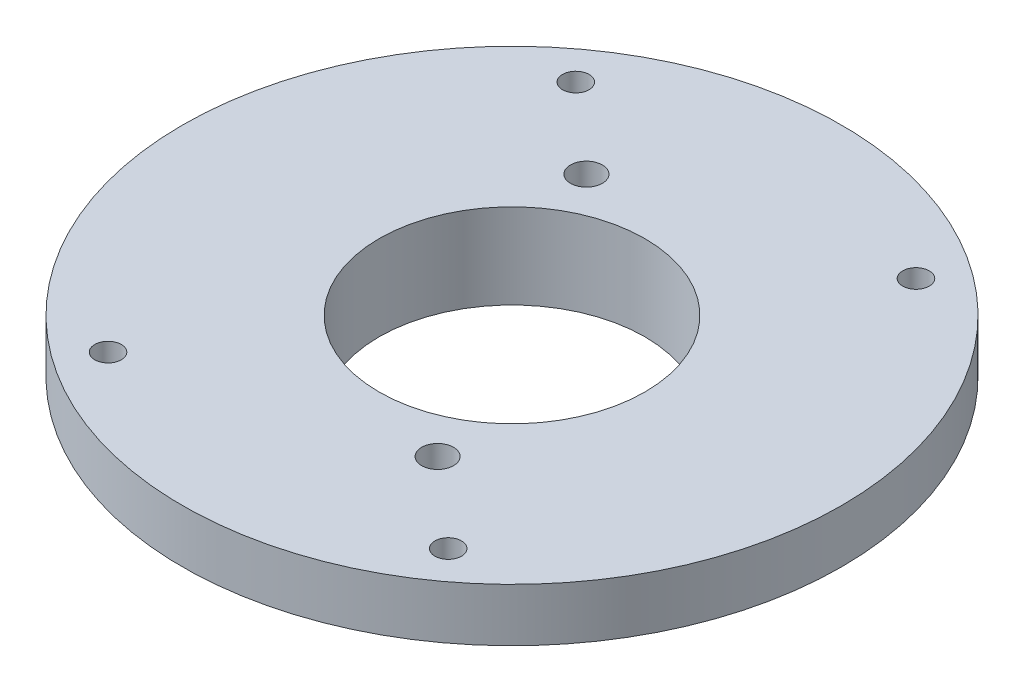
ISO-10303-21;
HEADER;
FILE_DESCRIPTION(('STEP AP214'),'2;1');
FILE_NAME('part.step','',(''),(''),'','','');
FILE_SCHEMA(('AUTOMOTIVE_DESIGN { 1 0 10303 214 1 1 1 1 }'));
ENDSEC;
DATA;
#1=APPLICATION_CONTEXT('core data for automotive mechanical design processes');
#2=APPLICATION_PROTOCOL_DEFINITION('international standard','automotive_design',2000,#1);
#3=PRODUCT_CONTEXT('',#1,'mechanical');
#4=PRODUCT('Part','Part','',(#3));
#5=PRODUCT_RELATED_PRODUCT_CATEGORY('part','',(#4));
#6=PRODUCT_DEFINITION_FORMATION('','',#4);
#7=PRODUCT_DEFINITION_CONTEXT('part definition',#1,'design');
#8=PRODUCT_DEFINITION('design','',#6,#7);
#9=PRODUCT_DEFINITION_SHAPE('','',#8);
#10=(LENGTH_UNIT() NAMED_UNIT(*) SI_UNIT(.MILLI.,.METRE.));
#11=(NAMED_UNIT(*) PLANE_ANGLE_UNIT() SI_UNIT($,.RADIAN.));
#12=(NAMED_UNIT(*) SI_UNIT($,.STERADIAN.) SOLID_ANGLE_UNIT());
#13=UNCERTAINTY_MEASURE_WITH_UNIT(LENGTH_MEASURE(1.E-05),#10,'distance_accuracy_value','');
#14=(GEOMETRIC_REPRESENTATION_CONTEXT(3) GLOBAL_UNCERTAINTY_ASSIGNED_CONTEXT((#13)) GLOBAL_UNIT_ASSIGNED_CONTEXT((#10,
#11,#12)) REPRESENTATION_CONTEXT('',''));
#15=CARTESIAN_POINT('',(0.,0.,0.));
#16=DIRECTION('',(0.,0.,1.));
#17=DIRECTION('',(1.,0.,0.));
#18=AXIS2_PLACEMENT_3D('',#15,#16,#17);
#19=CARTESIAN_POINT('',(-12.4999999999999,8.00000000000005,0.));
#20=DIRECTION('',(0.,1.,0.));
#21=DIRECTION('',(-1.,0.,0.));
#22=AXIS2_PLACEMENT_3D('',#19,#20,#21);
#23=PLANE('',#22);
#24=CARTESIAN_POINT('',(8.,8.00000000000005,15.));
#25=DIRECTION('',(0.,1.,0.));
#26=DIRECTION('',(-1.,0.,0.));
#27=AXIS2_PLACEMENT_3D('',#24,#25,#26);
#28=CIRCLE('',#27,1.5);
#29=CARTESIAN_POINT('',(6.50000000000001,8.00000000000005,15.));
#30=VERTEX_POINT('',#29);
#31=EDGE_CURVE('E108',#30,#30,#28,.T.);
#32=ORIENTED_EDGE('',*,*,#31,.F.);
#33=EDGE_LOOP('',(#32));
#34=FACE_BOUND('',#33,.T.);
#35=CARTESIAN_POINT('',(-8.00000000000033,8.00000000000005,-14.9999999999998));
#36=DIRECTION('',(0.,1.,0.));
#37=DIRECTION('',(-1.,0.,0.));
#38=AXIS2_PLACEMENT_3D('',#35,#36,#37);
#39=CIRCLE('',#38,1.5);
#40=CARTESIAN_POINT('',(-9.50000000000032,8.00000000000005,-14.9999999999998));
#41=VERTEX_POINT('',#40);
#42=EDGE_CURVE('E112',#41,#41,#39,.T.);
#43=ORIENTED_EDGE('',*,*,#42,.F.);
#44=EDGE_LOOP('',(#43));
#45=FACE_BOUND('',#44,.T.);
#46=CARTESIAN_POINT('',(-16.,8.00000000000005,22.));
#47=DIRECTION('',(0.,1.,0.));
#48=DIRECTION('',(-1.,0.,0.));
#49=AXIS2_PLACEMENT_3D('',#46,#47,#48);
#50=CIRCLE('',#49,1.25);
#51=CARTESIAN_POINT('',(-17.25,8.00000000000005,22.));
#52=VERTEX_POINT('',#51);
#53=EDGE_CURVE('E68',#52,#52,#50,.T.);
#54=ORIENTED_EDGE('',*,*,#53,.F.);
#55=EDGE_LOOP('',(#54));
#56=FACE_BOUND('',#55,.T.);
#57=CARTESIAN_POINT('',(16.,8.00000000000006,22.));
#58=DIRECTION('',(0.,1.,0.));
#59=DIRECTION('',(-1.,0.,0.));
#60=AXIS2_PLACEMENT_3D('',#57,#58,#59);
#61=CIRCLE('',#60,1.25);
#62=CARTESIAN_POINT('',(14.75,8.00000000000006,22.));
#63=VERTEX_POINT('',#62);
#64=EDGE_CURVE('E58',#63,#63,#61,.T.);
#65=ORIENTED_EDGE('',*,*,#64,.F.);
#66=EDGE_LOOP('',(#65));
#67=FACE_BOUND('',#66,.T.);
#68=CARTESIAN_POINT('',(16.,8.00000000000006,-22.));
#69=DIRECTION('',(0.,1.,0.));
#70=DIRECTION('',(-1.,0.,0.));
#71=AXIS2_PLACEMENT_3D('',#68,#69,#70);
#72=CIRCLE('',#71,1.25);
#73=CARTESIAN_POINT('',(14.75,8.00000000000006,-22.));
#74=VERTEX_POINT('',#73);
#75=EDGE_CURVE('E55',#74,#74,#72,.T.);
#76=ORIENTED_EDGE('',*,*,#75,.F.);
#77=EDGE_LOOP('',(#76));
#78=FACE_BOUND('',#77,.T.);
#79=CARTESIAN_POINT('',(-16.,8.00000000000005,-22.));
#80=DIRECTION('',(0.,1.,0.));
#81=DIRECTION('',(-1.,0.,0.));
#82=AXIS2_PLACEMENT_3D('',#79,#80,#81);
#83=CIRCLE('',#82,1.25);
#84=CARTESIAN_POINT('',(-17.25,8.00000000000005,-22.));
#85=VERTEX_POINT('',#84);
#86=EDGE_CURVE('E52',#85,#85,#83,.T.);
#87=ORIENTED_EDGE('',*,*,#86,.F.);
#88=EDGE_LOOP('',(#87));
#89=FACE_BOUND('',#88,.T.);
#90=CARTESIAN_POINT('',(0.,8.00000000000005,0.));
#91=DIRECTION('',(0.,1.,0.));
#92=DIRECTION('',(-1.,0.,0.));
#93=AXIS2_PLACEMENT_3D('',#90,#91,#92);
#94=CIRCLE('',#93,30.9999999999999);
#95=CARTESIAN_POINT('',(-30.9999999999999,8.00000000000004,0.));
#96=VERTEX_POINT('',#95);
#97=EDGE_CURVE('E39',#96,#96,#94,.T.);
#98=ORIENTED_EDGE('',*,*,#97,.T.);
#99=EDGE_LOOP('',(#98));
#100=FACE_BOUND('',#99,.T.);
#101=CARTESIAN_POINT('',(0.,8.00000000000006,0.));
#102=DIRECTION('',(0.,1.,0.));
#103=DIRECTION('',(-1.,0.,0.));
#104=AXIS2_PLACEMENT_3D('',#101,#102,#103);
#105=CIRCLE('',#104,12.4999999999999);
#106=CARTESIAN_POINT('',(-12.4999999999999,8.00000000000005,0.));
#107=VERTEX_POINT('',#106);
#108=EDGE_CURVE('E10',#107,#107,#105,.T.);
#109=ORIENTED_EDGE('',*,*,#108,.F.);
#110=EDGE_LOOP('',(#109));
#111=FACE_BOUND('',#110,.T.);
#112=ADVANCED_FACE('F32',(#34,#45,#56,#67,#78,#89,#100,#111),#23,.T.);
#113=CARTESIAN_POINT('',(0.,10.,0.));
#114=DIRECTION('',(0.,1.,0.));
#115=DIRECTION('',(-1.,0.,0.));
#116=AXIS2_PLACEMENT_3D('',#113,#114,#115);
#117=CYLINDRICAL_SURFACE('',#116,30.9999999999999);
#118=CARTESIAN_POINT('',(0.,3.00000000000005,0.));
#119=DIRECTION('',(0.,1.,0.));
#120=DIRECTION('',(-1.,0.,0.));
#121=AXIS2_PLACEMENT_3D('',#118,#119,#120);
#122=CIRCLE('',#121,30.9999999999999);
#123=CARTESIAN_POINT('',(-30.9999999999999,3.00000000000005,0.));
#124=VERTEX_POINT('',#123);
#125=EDGE_CURVE('E44',#124,#124,#122,.T.);
#126=ORIENTED_EDGE('',*,*,#125,.T.);
#127=EDGE_LOOP('',(#126));
#128=FACE_BOUND('',#127,.T.);
#129=ORIENTED_EDGE('',*,*,#97,.F.);
#130=EDGE_LOOP('',(#129));
#131=FACE_BOUND('',#130,.T.);
#132=ADVANCED_FACE('F84',(#128,#131),#117,.T.);
#133=CARTESIAN_POINT('',(-30.9999999999999,3.00000000000005,0.));
#134=DIRECTION('',(0.,-1.,0.));
#135=DIRECTION('',(1.,0.,0.));
#136=AXIS2_PLACEMENT_3D('',#133,#134,#135);
#137=PLANE('',#136);
#138=CARTESIAN_POINT('',(-16.,3.00000000000005,22.));
#139=DIRECTION('',(0.,-1.,0.));
#140=DIRECTION('',(1.,0.,0.));
#141=AXIS2_PLACEMENT_3D('',#138,#139,#140);
#142=CIRCLE('',#141,1.25);
#143=CARTESIAN_POINT('',(-14.75,3.00000000000005,22.));
#144=VERTEX_POINT('',#143);
#145=EDGE_CURVE('E35',#144,#144,#142,.T.);
#146=ORIENTED_EDGE('',*,*,#145,.F.);
#147=EDGE_LOOP('',(#146));
#148=FACE_BOUND('',#147,.T.);
#149=CARTESIAN_POINT('',(16.,3.00000000000005,22.));
#150=DIRECTION('',(0.,-1.,0.));
#151=DIRECTION('',(1.,0.,0.));
#152=AXIS2_PLACEMENT_3D('',#149,#150,#151);
#153=CIRCLE('',#152,1.25);
#154=CARTESIAN_POINT('',(17.25,3.00000000000005,22.));
#155=VERTEX_POINT('',#154);
#156=EDGE_CURVE('E56',#155,#155,#153,.T.);
#157=ORIENTED_EDGE('',*,*,#156,.F.);
#158=EDGE_LOOP('',(#157));
#159=FACE_BOUND('',#158,.T.);
#160=CARTESIAN_POINT('',(16.,3.00000000000005,-22.));
#161=DIRECTION('',(0.,-1.,0.));
#162=DIRECTION('',(1.,0.,0.));
#163=AXIS2_PLACEMENT_3D('',#160,#161,#162);
#164=CIRCLE('',#163,1.25);
#165=CARTESIAN_POINT('',(17.25,3.00000000000005,-22.));
#166=VERTEX_POINT('',#165);
#167=EDGE_CURVE('E53',#166,#166,#164,.T.);
#168=ORIENTED_EDGE('',*,*,#167,.F.);
#169=EDGE_LOOP('',(#168));
#170=FACE_BOUND('',#169,.T.);
#171=CARTESIAN_POINT('',(-16.,3.00000000000005,-22.));
#172=DIRECTION('',(0.,-1.,0.));
#173=DIRECTION('',(1.,0.,0.));
#174=AXIS2_PLACEMENT_3D('',#171,#172,#173);
#175=CIRCLE('',#174,1.25);
#176=CARTESIAN_POINT('',(-14.75,3.00000000000005,-22.));
#177=VERTEX_POINT('',#176);
#178=EDGE_CURVE('E48',#177,#177,#175,.T.);
#179=ORIENTED_EDGE('',*,*,#178,.F.);
#180=EDGE_LOOP('',(#179));
#181=FACE_BOUND('',#180,.T.);
#182=CARTESIAN_POINT('',(0.,3.00000000000005,0.));
#183=DIRECTION('',(0.,1.,0.));
#184=DIRECTION('',(-1.,0.,0.));
#185=AXIS2_PLACEMENT_3D('',#182,#183,#184);
#186=CIRCLE('',#185,22.4999999999999);
#187=CARTESIAN_POINT('',(-22.4999999999999,3.00000000000005,0.));
#188=VERTEX_POINT('',#187);
#189=EDGE_CURVE('E79',#188,#188,#186,.T.);
#190=ORIENTED_EDGE('',*,*,#189,.T.);
#191=EDGE_LOOP('',(#190));
#192=FACE_BOUND('',#191,.T.);
#193=ORIENTED_EDGE('',*,*,#125,.F.);
#194=EDGE_LOOP('',(#193));
#195=FACE_BOUND('',#194,.T.);
#196=ADVANCED_FACE('F87',(#148,#159,#170,#181,#192,#195),#137,.T.);
#197=CARTESIAN_POINT('',(0.,10.,0.));
#198=DIRECTION('',(0.,1.,0.));
#199=DIRECTION('',(-1.,0.,0.));
#200=AXIS2_PLACEMENT_3D('',#197,#198,#199);
#201=CYLINDRICAL_SURFACE('',#200,22.4999999999999);
#202=CARTESIAN_POINT('',(0.,0.,0.));
#203=DIRECTION('',(0.,1.,0.));
#204=DIRECTION('',(-1.,0.,0.));
#205=AXIS2_PLACEMENT_3D('',#202,#203,#204);
#206=CIRCLE('',#205,22.4999999999999);
#207=CARTESIAN_POINT('',(-22.4999999999999,0.,0.));
#208=VERTEX_POINT('',#207);
#209=EDGE_CURVE('E76',#208,#208,#206,.T.);
#210=ORIENTED_EDGE('',*,*,#209,.T.);
#211=EDGE_LOOP('',(#210));
#212=FACE_BOUND('',#211,.T.);
#213=ORIENTED_EDGE('',*,*,#189,.F.);
#214=EDGE_LOOP('',(#213));
#215=FACE_BOUND('',#214,.T.);
#216=ADVANCED_FACE('F89',(#212,#215),#201,.T.);
#217=CARTESIAN_POINT('',(-22.4999999999999,0.,0.));
#218=DIRECTION('',(0.,-1.,0.));
#219=DIRECTION('',(1.,0.,0.));
#220=AXIS2_PLACEMENT_3D('',#217,#218,#219);
#221=PLANE('',#220);
#222=CARTESIAN_POINT('',(8.,0.,15.));
#223=DIRECTION('',(0.,1.,0.));
#224=DIRECTION('',(-1.,0.,0.));
#225=AXIS2_PLACEMENT_3D('',#222,#223,#224);
#226=CIRCLE('',#225,1.5);
#227=CARTESIAN_POINT('',(6.50000000000001,0.,15.));
#228=VERTEX_POINT('',#227);
#229=EDGE_CURVE('E147',#228,#228,#226,.T.);
#230=ORIENTED_EDGE('',*,*,#229,.T.);
#231=EDGE_LOOP('',(#230));
#232=FACE_BOUND('',#231,.T.);
#233=CARTESIAN_POINT('',(-8.00000000000033,0.,-14.9999999999998));
#234=DIRECTION('',(0.,1.,0.));
#235=DIRECTION('',(-1.,0.,0.));
#236=AXIS2_PLACEMENT_3D('',#233,#234,#235);
#237=CIRCLE('',#236,1.5);
#238=CARTESIAN_POINT('',(-9.50000000000032,0.,-14.9999999999998));
#239=VERTEX_POINT('',#238);
#240=EDGE_CURVE('E151',#239,#239,#237,.T.);
#241=ORIENTED_EDGE('',*,*,#240,.T.);
#242=EDGE_LOOP('',(#241));
#243=FACE_BOUND('',#242,.T.);
#244=CARTESIAN_POINT('',(0.,0.,0.));
#245=DIRECTION('',(0.,1.,0.));
#246=DIRECTION('',(-1.,0.,0.));
#247=AXIS2_PLACEMENT_3D('',#244,#245,#246);
#248=CIRCLE('',#247,12.4999999999999);
#249=CARTESIAN_POINT('',(-12.4999999999999,0.,0.));
#250=VERTEX_POINT('',#249);
#251=EDGE_CURVE('E51',#250,#250,#248,.T.);
#252=ORIENTED_EDGE('',*,*,#251,.T.);
#253=EDGE_LOOP('',(#252));
#254=FACE_BOUND('',#253,.T.);
#255=ORIENTED_EDGE('',*,*,#209,.F.);
#256=EDGE_LOOP('',(#255));
#257=FACE_BOUND('',#256,.T.);
#258=ADVANCED_FACE('F96',(#232,#243,#254,#257),#221,.T.);
#259=CARTESIAN_POINT('',(0.,10.,0.));
#260=DIRECTION('',(0.,1.,0.));
#261=DIRECTION('',(-1.,0.,0.));
#262=AXIS2_PLACEMENT_3D('',#259,#260,#261);
#263=CYLINDRICAL_SURFACE('',#262,12.4999999999999);
#264=ORIENTED_EDGE('',*,*,#108,.T.);
#265=EDGE_LOOP('',(#264));
#266=FACE_BOUND('',#265,.T.);
#267=ORIENTED_EDGE('',*,*,#251,.F.);
#268=EDGE_LOOP('',(#267));
#269=FACE_BOUND('',#268,.T.);
#270=ADVANCED_FACE('F127',(#266,#269),#263,.F.);
#271=CARTESIAN_POINT('',(-16.,0.,-22.));
#272=DIRECTION('',(0.,1.,0.));
#273=DIRECTION('',(-1.,0.,0.));
#274=AXIS2_PLACEMENT_3D('',#271,#272,#273);
#275=CYLINDRICAL_SURFACE('',#274,1.25);
#276=ORIENTED_EDGE('',*,*,#178,.T.);
#277=EDGE_LOOP('',(#276));
#278=FACE_BOUND('',#277,.T.);
#279=ORIENTED_EDGE('',*,*,#86,.T.);
#280=EDGE_LOOP('',(#279));
#281=FACE_BOUND('',#280,.T.);
#282=ADVANCED_FACE('F124',(#278,#281),#275,.F.);
#283=CARTESIAN_POINT('',(16.,0.,-22.));
#284=DIRECTION('',(0.,1.,0.));
#285=DIRECTION('',(-1.,0.,0.));
#286=AXIS2_PLACEMENT_3D('',#283,#284,#285);
#287=CYLINDRICAL_SURFACE('',#286,1.25);
#288=ORIENTED_EDGE('',*,*,#167,.T.);
#289=EDGE_LOOP('',(#288));
#290=FACE_BOUND('',#289,.T.);
#291=ORIENTED_EDGE('',*,*,#75,.T.);
#292=EDGE_LOOP('',(#291));
#293=FACE_BOUND('',#292,.T.);
#294=ADVANCED_FACE('F126',(#290,#293),#287,.F.);
#295=CARTESIAN_POINT('',(16.,0.,22.));
#296=DIRECTION('',(0.,1.,0.));
#297=DIRECTION('',(-1.,0.,0.));
#298=AXIS2_PLACEMENT_3D('',#295,#296,#297);
#299=CYLINDRICAL_SURFACE('',#298,1.25);
#300=ORIENTED_EDGE('',*,*,#156,.T.);
#301=EDGE_LOOP('',(#300));
#302=FACE_BOUND('',#301,.T.);
#303=ORIENTED_EDGE('',*,*,#64,.T.);
#304=EDGE_LOOP('',(#303));
#305=FACE_BOUND('',#304,.T.);
#306=ADVANCED_FACE('F134',(#302,#305),#299,.F.);
#307=CARTESIAN_POINT('',(-16.,0.,22.));
#308=DIRECTION('',(0.,1.,0.));
#309=DIRECTION('',(-1.,0.,0.));
#310=AXIS2_PLACEMENT_3D('',#307,#308,#309);
#311=CYLINDRICAL_SURFACE('',#310,1.25);
#312=ORIENTED_EDGE('',*,*,#145,.T.);
#313=EDGE_LOOP('',(#312));
#314=FACE_BOUND('',#313,.T.);
#315=ORIENTED_EDGE('',*,*,#53,.T.);
#316=EDGE_LOOP('',(#315));
#317=FACE_BOUND('',#316,.T.);
#318=ADVANCED_FACE('F172',(#314,#317),#311,.F.);
#319=CARTESIAN_POINT('',(-8.00000000000033,0.,-14.9999999999998));
#320=DIRECTION('',(0.,1.,0.));
#321=DIRECTION('',(-1.,0.,0.));
#322=AXIS2_PLACEMENT_3D('',#319,#320,#321);
#323=CYLINDRICAL_SURFACE('',#322,1.5);
#324=ORIENTED_EDGE('',*,*,#240,.F.);
#325=EDGE_LOOP('',(#324));
#326=FACE_BOUND('',#325,.T.);
#327=ORIENTED_EDGE('',*,*,#42,.T.);
#328=EDGE_LOOP('',(#327));
#329=FACE_BOUND('',#328,.T.);
#330=ADVANCED_FACE('F166',(#326,#329),#323,.F.);
#331=CARTESIAN_POINT('',(8.,0.,15.));
#332=DIRECTION('',(0.,1.,0.));
#333=DIRECTION('',(-1.,0.,0.));
#334=AXIS2_PLACEMENT_3D('',#331,#332,#333);
#335=CYLINDRICAL_SURFACE('',#334,1.5);
#336=ORIENTED_EDGE('',*,*,#229,.F.);
#337=EDGE_LOOP('',(#336));
#338=FACE_BOUND('',#337,.T.);
#339=ORIENTED_EDGE('',*,*,#31,.T.);
#340=EDGE_LOOP('',(#339));
#341=FACE_BOUND('',#340,.T.);
#342=ADVANCED_FACE('F164',(#338,#341),#335,.F.);
#343=CLOSED_SHELL('',(#112,#132,#196,#216,#258,#270,#282,#294,#306,#318,#330,#342));
#344=MANIFOLD_SOLID_BREP('B2',#343);
#345=ADVANCED_BREP_SHAPE_REPRESENTATION('',(#18,#344),#14);
#346=SHAPE_DEFINITION_REPRESENTATION(#9,#345);
ENDSEC;
END-ISO-10303-21;
